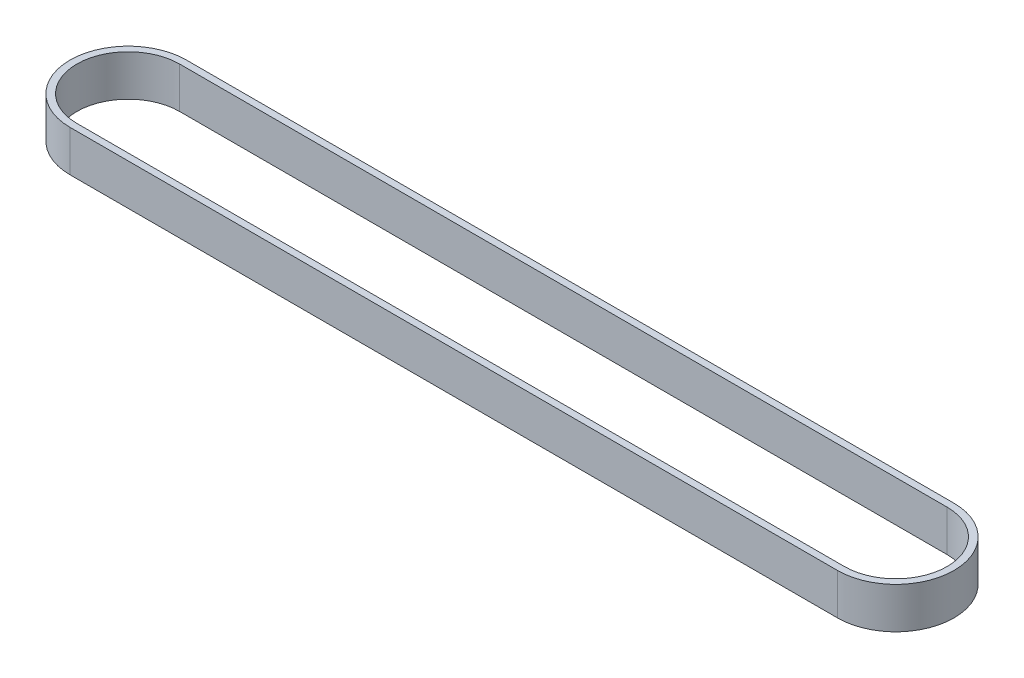
ISO-10303-21;
HEADER;
FILE_DESCRIPTION(('STEP AP214'),'2;1');
FILE_NAME('part.step','',(''),(''),'','','');
FILE_SCHEMA(('AUTOMOTIVE_DESIGN { 1 0 10303 214 1 1 1 1 }'));
ENDSEC;
DATA;
#1=APPLICATION_CONTEXT('core data for automotive mechanical design processes');
#2=APPLICATION_PROTOCOL_DEFINITION('international standard','automotive_design',2000,#1);
#3=PRODUCT_CONTEXT('',#1,'mechanical');
#4=PRODUCT('Part','Part','',(#3));
#5=PRODUCT_RELATED_PRODUCT_CATEGORY('part','',(#4));
#6=PRODUCT_DEFINITION_FORMATION('','',#4);
#7=PRODUCT_DEFINITION_CONTEXT('part definition',#1,'design');
#8=PRODUCT_DEFINITION('design','',#6,#7);
#9=PRODUCT_DEFINITION_SHAPE('','',#8);
#10=(LENGTH_UNIT() NAMED_UNIT(*) SI_UNIT(.MILLI.,.METRE.));
#11=(NAMED_UNIT(*) PLANE_ANGLE_UNIT() SI_UNIT($,.RADIAN.));
#12=(NAMED_UNIT(*) SI_UNIT($,.STERADIAN.) SOLID_ANGLE_UNIT());
#13=UNCERTAINTY_MEASURE_WITH_UNIT(LENGTH_MEASURE(1.E-05),#10,'distance_accuracy_value','');
#14=(GEOMETRIC_REPRESENTATION_CONTEXT(3) GLOBAL_UNCERTAINTY_ASSIGNED_CONTEXT((#13)) GLOBAL_UNIT_ASSIGNED_CONTEXT((#10,
#11,#12)) REPRESENTATION_CONTEXT('',''));
#15=CARTESIAN_POINT('',(0.,0.,0.));
#16=DIRECTION('',(0.,0.,1.));
#17=DIRECTION('',(1.,0.,0.));
#18=AXIS2_PLACEMENT_3D('',#15,#16,#17);
#19=CARTESIAN_POINT('',(0.,6.,0.));
#20=DIRECTION('',(0.,1.,0.));
#21=DIRECTION('',(0.,0.,1.));
#22=AXIS2_PLACEMENT_3D('',#19,#20,#21);
#23=PLANE('',#22);
#24=CARTESIAN_POINT('',(0.,6.,0.));
#25=DIRECTION('',(0.,1.,0.));
#26=DIRECTION('',(0.,0.,1.));
#27=AXIS2_PLACEMENT_3D('',#24,#25,#26);
#28=CIRCLE('',#27,8.5);
#29=CARTESIAN_POINT('',(0.,6.,-8.5));
#30=VERTEX_POINT('',#29);
#31=CARTESIAN_POINT('',(0.,6.,8.5));
#32=VERTEX_POINT('',#31);
#33=EDGE_CURVE('E179',#30,#32,#28,.T.);
#34=ORIENTED_EDGE('',*,*,#33,.T.);
#35=DIRECTION('',(1.,0.,0.));
#36=VECTOR('',#35,1.);
#37=CARTESIAN_POINT('',(0.,6.,8.5));
#38=LINE('',#37,#36);
#39=CARTESIAN_POINT('',(112.,6.,8.5));
#40=VERTEX_POINT('',#39);
#41=EDGE_CURVE('E183',#32,#40,#38,.T.);
#42=ORIENTED_EDGE('',*,*,#41,.T.);
#43=CARTESIAN_POINT('',(112.,6.,0.));
#44=DIRECTION('',(0.,1.,0.));
#45=DIRECTION('',(0.,0.,1.));
#46=AXIS2_PLACEMENT_3D('',#43,#44,#45);
#47=CIRCLE('',#46,8.5);
#48=CARTESIAN_POINT('',(112.,6.,-8.5));
#49=VERTEX_POINT('',#48);
#50=EDGE_CURVE('E187',#40,#49,#47,.T.);
#51=ORIENTED_EDGE('',*,*,#50,.T.);
#52=DIRECTION('',(-1.,0.,0.));
#53=VECTOR('',#52,1.);
#54=CARTESIAN_POINT('',(0.,6.,-8.5));
#55=LINE('',#54,#53);
#56=EDGE_CURVE('E190',#49,#30,#55,.T.);
#57=ORIENTED_EDGE('',*,*,#56,.T.);
#58=EDGE_LOOP('',(#34,#42,#51,#57));
#59=FACE_BOUND('',#58,.T.);
#60=DIRECTION('',(1.,0.,0.));
#61=VECTOR('',#60,1.);
#62=CARTESIAN_POINT('',(0.,6.,7.5));
#63=LINE('',#62,#61);
#64=CARTESIAN_POINT('',(0.,6.,7.5));
#65=VERTEX_POINT('',#64);
#66=CARTESIAN_POINT('',(112.,6.,7.5));
#67=VERTEX_POINT('',#66);
#68=EDGE_CURVE('E140',#65,#67,#63,.T.);
#69=ORIENTED_EDGE('',*,*,#68,.F.);
#70=CARTESIAN_POINT('',(0.,6.,0.));
#71=DIRECTION('',(0.,1.,0.));
#72=DIRECTION('',(0.,0.,1.));
#73=AXIS2_PLACEMENT_3D('',#70,#71,#72);
#74=CIRCLE('',#73,7.5);
#75=CARTESIAN_POINT('',(0.,6.,-7.5));
#76=VERTEX_POINT('',#75);
#77=EDGE_CURVE('E131',#76,#65,#74,.T.);
#78=ORIENTED_EDGE('',*,*,#77,.F.);
#79=DIRECTION('',(-1.,0.,0.));
#80=VECTOR('',#79,1.);
#81=CARTESIAN_POINT('',(0.,6.,-7.5));
#82=LINE('',#81,#80);
#83=CARTESIAN_POINT('',(112.,6.,-7.5));
#84=VERTEX_POINT('',#83);
#85=EDGE_CURVE('E157',#84,#76,#82,.T.);
#86=ORIENTED_EDGE('',*,*,#85,.F.);
#87=CARTESIAN_POINT('',(112.,6.,0.));
#88=DIRECTION('',(0.,1.,0.));
#89=DIRECTION('',(0.,0.,1.));
#90=AXIS2_PLACEMENT_3D('',#87,#88,#89);
#91=CIRCLE('',#90,7.5);
#92=EDGE_CURVE('E153',#67,#84,#91,.T.);
#93=ORIENTED_EDGE('',*,*,#92,.F.);
#94=EDGE_LOOP('',(#69,#78,#86,#93));
#95=FACE_BOUND('',#94,.T.);
#96=ADVANCED_FACE('F49',(#59,#95),#23,.T.);
#97=CARTESIAN_POINT('',(0.,0.,0.));
#98=DIRECTION('',(0.,1.,0.));
#99=DIRECTION('',(0.,0.,1.));
#100=AXIS2_PLACEMENT_3D('',#97,#98,#99);
#101=PLANE('',#100);
#102=CARTESIAN_POINT('',(0.,0.,0.));
#103=DIRECTION('',(0.,1.,0.));
#104=DIRECTION('',(0.,0.,1.));
#105=AXIS2_PLACEMENT_3D('',#102,#103,#104);
#106=CIRCLE('',#105,8.5);
#107=CARTESIAN_POINT('',(0.,0.,-8.5));
#108=VERTEX_POINT('',#107);
#109=CARTESIAN_POINT('',(0.,0.,8.5));
#110=VERTEX_POINT('',#109);
#111=EDGE_CURVE('E149',#108,#110,#106,.T.);
#112=ORIENTED_EDGE('',*,*,#111,.F.);
#113=DIRECTION('',(-1.,0.,0.));
#114=VECTOR('',#113,1.);
#115=CARTESIAN_POINT('',(0.,0.,-8.5));
#116=LINE('',#115,#114);
#117=CARTESIAN_POINT('',(112.,0.,-8.5));
#118=VERTEX_POINT('',#117);
#119=EDGE_CURVE('E184',#118,#108,#116,.T.);
#120=ORIENTED_EDGE('',*,*,#119,.F.);
#121=CARTESIAN_POINT('',(112.,0.,0.));
#122=DIRECTION('',(0.,1.,0.));
#123=DIRECTION('',(0.,0.,1.));
#124=AXIS2_PLACEMENT_3D('',#121,#122,#123);
#125=CIRCLE('',#124,8.5);
#126=CARTESIAN_POINT('',(112.,0.,8.5));
#127=VERTEX_POINT('',#126);
#128=EDGE_CURVE('E200',#127,#118,#125,.T.);
#129=ORIENTED_EDGE('',*,*,#128,.F.);
#130=DIRECTION('',(1.,0.,0.));
#131=VECTOR('',#130,1.);
#132=CARTESIAN_POINT('',(0.,0.,8.5));
#133=LINE('',#132,#131);
#134=EDGE_CURVE('E197',#110,#127,#133,.T.);
#135=ORIENTED_EDGE('',*,*,#134,.F.);
#136=EDGE_LOOP('',(#112,#120,#129,#135));
#137=FACE_BOUND('',#136,.T.);
#138=CARTESIAN_POINT('',(0.,0.,0.));
#139=DIRECTION('',(0.,1.,0.));
#140=DIRECTION('',(0.,0.,1.));
#141=AXIS2_PLACEMENT_3D('',#138,#139,#140);
#142=CIRCLE('',#141,7.5);
#143=CARTESIAN_POINT('',(0.,0.,-7.5));
#144=VERTEX_POINT('',#143);
#145=CARTESIAN_POINT('',(0.,0.,7.5));
#146=VERTEX_POINT('',#145);
#147=EDGE_CURVE('E79',#144,#146,#142,.T.);
#148=ORIENTED_EDGE('',*,*,#147,.T.);
#149=DIRECTION('',(1.,0.,0.));
#150=VECTOR('',#149,1.);
#151=CARTESIAN_POINT('',(0.,0.,7.5));
#152=LINE('',#151,#150);
#153=CARTESIAN_POINT('',(112.,0.,7.5));
#154=VERTEX_POINT('',#153);
#155=EDGE_CURVE('E147',#146,#154,#152,.T.);
#156=ORIENTED_EDGE('',*,*,#155,.T.);
#157=CARTESIAN_POINT('',(112.,0.,0.));
#158=DIRECTION('',(0.,1.,0.));
#159=DIRECTION('',(0.,0.,1.));
#160=AXIS2_PLACEMENT_3D('',#157,#158,#159);
#161=CIRCLE('',#160,7.5);
#162=CARTESIAN_POINT('',(112.,0.,-7.5));
#163=VERTEX_POINT('',#162);
#164=EDGE_CURVE('E166',#154,#163,#161,.T.);
#165=ORIENTED_EDGE('',*,*,#164,.T.);
#166=DIRECTION('',(-1.,0.,0.));
#167=VECTOR('',#166,1.);
#168=CARTESIAN_POINT('',(0.,0.,-7.5));
#169=LINE('',#168,#167);
#170=EDGE_CURVE('E141',#163,#144,#169,.T.);
#171=ORIENTED_EDGE('',*,*,#170,.T.);
#172=EDGE_LOOP('',(#148,#156,#165,#171));
#173=FACE_BOUND('',#172,.T.);
#174=ADVANCED_FACE('F223',(#137,#173),#101,.F.);
#175=CARTESIAN_POINT('',(0.,6.,0.));
#176=DIRECTION('',(0.,-1.,0.));
#177=DIRECTION('',(0.,0.,-1.));
#178=AXIS2_PLACEMENT_3D('',#175,#176,#177);
#179=CYLINDRICAL_SURFACE('',#178,8.5);
#180=ORIENTED_EDGE('',*,*,#111,.T.);
#181=DIRECTION('',(0.,-1.,0.));
#182=VECTOR('',#181,1.);
#183=CARTESIAN_POINT('',(0.,6.,8.5));
#184=LINE('',#183,#182);
#185=EDGE_CURVE('E11',#32,#110,#184,.T.);
#186=ORIENTED_EDGE('',*,*,#185,.F.);
#187=ORIENTED_EDGE('',*,*,#33,.F.);
#188=DIRECTION('',(0.,-1.,0.));
#189=VECTOR('',#188,1.);
#190=CARTESIAN_POINT('',(0.,6.,-8.5));
#191=LINE('',#190,#189);
#192=EDGE_CURVE('E193',#30,#108,#191,.T.);
#193=ORIENTED_EDGE('',*,*,#192,.T.);
#194=EDGE_LOOP('',(#180,#186,#187,#193));
#195=FACE_BOUND('',#194,.T.);
#196=ADVANCED_FACE('F51',(#195),#179,.T.);
#197=CARTESIAN_POINT('',(0.,6.,8.5));
#198=DIRECTION('',(0.,0.,-1.));
#199=DIRECTION('',(-1.,0.,0.));
#200=AXIS2_PLACEMENT_3D('',#197,#198,#199);
#201=PLANE('',#200);
#202=ORIENTED_EDGE('',*,*,#134,.T.);
#203=DIRECTION('',(0.,-1.,0.));
#204=VECTOR('',#203,1.);
#205=CARTESIAN_POINT('',(112.,6.,8.5));
#206=LINE('',#205,#204);
#207=EDGE_CURVE('E58',#40,#127,#206,.T.);
#208=ORIENTED_EDGE('',*,*,#207,.F.);
#209=ORIENTED_EDGE('',*,*,#41,.F.);
#210=ORIENTED_EDGE('',*,*,#185,.T.);
#211=EDGE_LOOP('',(#202,#208,#209,#210));
#212=FACE_BOUND('',#211,.T.);
#213=ADVANCED_FACE('F233',(#212),#201,.F.);
#214=CARTESIAN_POINT('',(112.,6.,0.));
#215=DIRECTION('',(0.,-1.,0.));
#216=DIRECTION('',(0.,0.,-1.));
#217=AXIS2_PLACEMENT_3D('',#214,#215,#216);
#218=CYLINDRICAL_SURFACE('',#217,8.5);
#219=ORIENTED_EDGE('',*,*,#128,.T.);
#220=DIRECTION('',(0.,-1.,0.));
#221=VECTOR('',#220,1.);
#222=CARTESIAN_POINT('',(112.,6.,-8.5));
#223=LINE('',#222,#221);
#224=EDGE_CURVE('E208',#49,#118,#223,.T.);
#225=ORIENTED_EDGE('',*,*,#224,.F.);
#226=ORIENTED_EDGE('',*,*,#50,.F.);
#227=ORIENTED_EDGE('',*,*,#207,.T.);
#228=EDGE_LOOP('',(#219,#225,#226,#227));
#229=FACE_BOUND('',#228,.T.);
#230=ADVANCED_FACE('F217',(#229),#218,.T.);
#231=CARTESIAN_POINT('',(0.,6.,-8.5));
#232=DIRECTION('',(0.,0.,1.));
#233=DIRECTION('',(1.,0.,0.));
#234=AXIS2_PLACEMENT_3D('',#231,#232,#233);
#235=PLANE('',#234);
#236=ORIENTED_EDGE('',*,*,#119,.T.);
#237=ORIENTED_EDGE('',*,*,#192,.F.);
#238=ORIENTED_EDGE('',*,*,#56,.F.);
#239=ORIENTED_EDGE('',*,*,#224,.T.);
#240=EDGE_LOOP('',(#236,#237,#238,#239));
#241=FACE_BOUND('',#240,.T.);
#242=ADVANCED_FACE('F227',(#241),#235,.F.);
#243=CARTESIAN_POINT('',(0.,6.,0.));
#244=DIRECTION('',(0.,-1.,0.));
#245=DIRECTION('',(0.,0.,-1.));
#246=AXIS2_PLACEMENT_3D('',#243,#244,#245);
#247=CYLINDRICAL_SURFACE('',#246,7.5);
#248=ORIENTED_EDGE('',*,*,#147,.F.);
#249=DIRECTION('',(0.,-1.,0.));
#250=VECTOR('',#249,1.);
#251=CARTESIAN_POINT('',(0.,6.,-7.5));
#252=LINE('',#251,#250);
#253=EDGE_CURVE('E135',#76,#144,#252,.T.);
#254=ORIENTED_EDGE('',*,*,#253,.F.);
#255=ORIENTED_EDGE('',*,*,#77,.T.);
#256=DIRECTION('',(0.,-1.,0.));
#257=VECTOR('',#256,1.);
#258=CARTESIAN_POINT('',(0.,6.,7.5));
#259=LINE('',#258,#257);
#260=EDGE_CURVE('E134',#65,#146,#259,.T.);
#261=ORIENTED_EDGE('',*,*,#260,.T.);
#262=EDGE_LOOP('',(#248,#254,#255,#261));
#263=FACE_BOUND('',#262,.T.);
#264=ADVANCED_FACE('F133',(#263),#247,.F.);
#265=CARTESIAN_POINT('',(0.,6.,7.5));
#266=DIRECTION('',(0.,0.,-1.));
#267=DIRECTION('',(-1.,0.,0.));
#268=AXIS2_PLACEMENT_3D('',#265,#266,#267);
#269=PLANE('',#268);
#270=ORIENTED_EDGE('',*,*,#155,.F.);
#271=ORIENTED_EDGE('',*,*,#260,.F.);
#272=ORIENTED_EDGE('',*,*,#68,.T.);
#273=DIRECTION('',(0.,-1.,0.));
#274=VECTOR('',#273,1.);
#275=CARTESIAN_POINT('',(112.,6.,7.5));
#276=LINE('',#275,#274);
#277=EDGE_CURVE('E150',#67,#154,#276,.T.);
#278=ORIENTED_EDGE('',*,*,#277,.T.);
#279=EDGE_LOOP('',(#270,#271,#272,#278));
#280=FACE_BOUND('',#279,.T.);
#281=ADVANCED_FACE('F144',(#280),#269,.T.);
#282=CARTESIAN_POINT('',(112.,6.,0.));
#283=DIRECTION('',(0.,-1.,0.));
#284=DIRECTION('',(0.,0.,-1.));
#285=AXIS2_PLACEMENT_3D('',#282,#283,#284);
#286=CYLINDRICAL_SURFACE('',#285,7.5);
#287=ORIENTED_EDGE('',*,*,#164,.F.);
#288=ORIENTED_EDGE('',*,*,#277,.F.);
#289=ORIENTED_EDGE('',*,*,#92,.T.);
#290=DIRECTION('',(0.,-1.,0.));
#291=VECTOR('',#290,1.);
#292=CARTESIAN_POINT('',(112.,6.,-7.5));
#293=LINE('',#292,#291);
#294=EDGE_CURVE('E68',#84,#163,#293,.T.);
#295=ORIENTED_EDGE('',*,*,#294,.T.);
#296=EDGE_LOOP('',(#287,#288,#289,#295));
#297=FACE_BOUND('',#296,.T.);
#298=ADVANCED_FACE('F254',(#297),#286,.F.);
#299=CARTESIAN_POINT('',(0.,6.,-7.5));
#300=DIRECTION('',(0.,0.,1.));
#301=DIRECTION('',(1.,0.,0.));
#302=AXIS2_PLACEMENT_3D('',#299,#300,#301);
#303=PLANE('',#302);
#304=ORIENTED_EDGE('',*,*,#170,.F.);
#305=ORIENTED_EDGE('',*,*,#294,.F.);
#306=ORIENTED_EDGE('',*,*,#85,.T.);
#307=ORIENTED_EDGE('',*,*,#253,.T.);
#308=EDGE_LOOP('',(#304,#305,#306,#307));
#309=FACE_BOUND('',#308,.T.);
#310=ADVANCED_FACE('F257',(#309),#303,.T.);
#311=CLOSED_SHELL('',(#96,#174,#196,#213,#230,#242,#264,#281,#298,#310));
#312=MANIFOLD_SOLID_BREP('B2',#311);
#313=ADVANCED_BREP_SHAPE_REPRESENTATION('',(#18,#312),#14);
#314=SHAPE_DEFINITION_REPRESENTATION(#9,#313);
ENDSEC;
END-ISO-10303-21;
